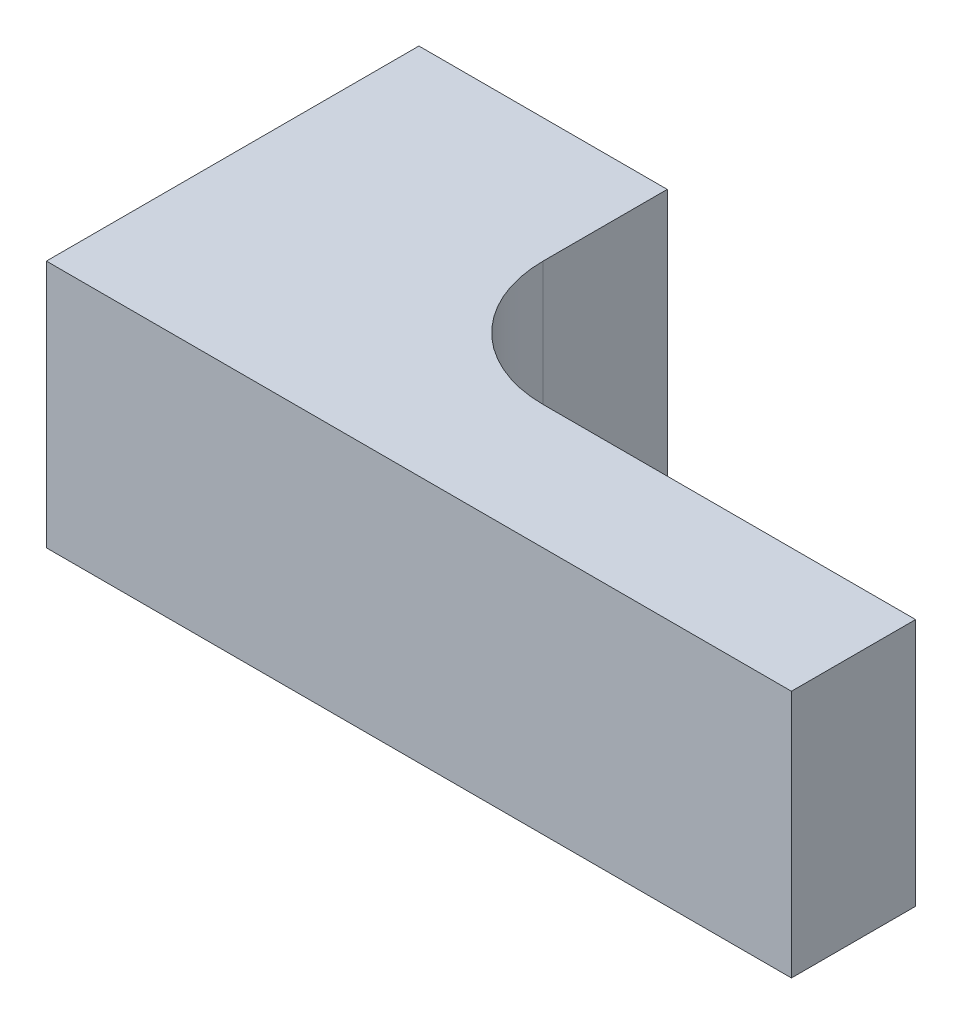
ISO-10303-21;
HEADER;
FILE_DESCRIPTION(('STEP AP214'),'2;1');
FILE_NAME('part.step','',(''),(''),'','','');
FILE_SCHEMA(('AUTOMOTIVE_DESIGN { 1 0 10303 214 1 1 1 1 }'));
ENDSEC;
DATA;
#1=APPLICATION_CONTEXT('core data for automotive mechanical design processes');
#2=APPLICATION_PROTOCOL_DEFINITION('international standard','automotive_design',2000,#1);
#3=PRODUCT_CONTEXT('',#1,'mechanical');
#4=PRODUCT('Part','Part','',(#3));
#5=PRODUCT_RELATED_PRODUCT_CATEGORY('part','',(#4));
#6=PRODUCT_DEFINITION_FORMATION('','',#4);
#7=PRODUCT_DEFINITION_CONTEXT('part definition',#1,'design');
#8=PRODUCT_DEFINITION('design','',#6,#7);
#9=PRODUCT_DEFINITION_SHAPE('','',#8);
#10=(LENGTH_UNIT() NAMED_UNIT(*) SI_UNIT(.MILLI.,.METRE.));
#11=(NAMED_UNIT(*) PLANE_ANGLE_UNIT() SI_UNIT($,.RADIAN.));
#12=(NAMED_UNIT(*) SI_UNIT($,.STERADIAN.) SOLID_ANGLE_UNIT());
#13=UNCERTAINTY_MEASURE_WITH_UNIT(LENGTH_MEASURE(1.E-05),#10,'distance_accuracy_value','');
#14=(GEOMETRIC_REPRESENTATION_CONTEXT(3) GLOBAL_UNCERTAINTY_ASSIGNED_CONTEXT((#13)) GLOBAL_UNIT_ASSIGNED_CONTEXT((#10,
#11,#12)) REPRESENTATION_CONTEXT('',''));
#15=CARTESIAN_POINT('',(0.,0.,0.));
#16=DIRECTION('',(0.,0.,1.));
#17=DIRECTION('',(1.,0.,0.));
#18=AXIS2_PLACEMENT_3D('',#15,#16,#17);
#19=CARTESIAN_POINT('',(-20.,20.,0.));
#20=DIRECTION('',(0.,0.,1.));
#21=DIRECTION('',(1.,0.,0.));
#22=AXIS2_PLACEMENT_3D('',#19,#20,#21);
#23=PLANE('',#22);
#24=DIRECTION('',(-1.,0.,0.));
#25=VECTOR('',#24,1.);
#26=CARTESIAN_POINT('',(-20.,0.,0.));
#27=LINE('',#26,#25);
#28=CARTESIAN_POINT('',(0.,0.,0.));
#29=VERTEX_POINT('',#28);
#30=CARTESIAN_POINT('',(-20.,0.,0.));
#31=VERTEX_POINT('',#30);
#32=EDGE_CURVE('E134',#29,#31,#27,.T.);
#33=ORIENTED_EDGE('',*,*,#32,.T.);
#34=DIRECTION('',(0.,-1.,0.));
#35=VECTOR('',#34,1.);
#36=CARTESIAN_POINT('',(-20.,20.,0.));
#37=LINE('',#36,#35);
#38=CARTESIAN_POINT('',(-20.,20.,0.));
#39=VERTEX_POINT('',#38);
#40=EDGE_CURVE('E11',#39,#31,#37,.T.);
#41=ORIENTED_EDGE('',*,*,#40,.F.);
#42=DIRECTION('',(-1.,0.,0.));
#43=VECTOR('',#42,1.);
#44=CARTESIAN_POINT('',(-20.,20.,0.));
#45=LINE('',#44,#43);
#46=CARTESIAN_POINT('',(0.,20.,0.));
#47=VERTEX_POINT('',#46);
#48=EDGE_CURVE('E153',#47,#39,#45,.T.);
#49=ORIENTED_EDGE('',*,*,#48,.F.);
#50=DIRECTION('',(0.,-1.,0.));
#51=VECTOR('',#50,1.);
#52=CARTESIAN_POINT('',(0.,20.,0.));
#53=LINE('',#52,#51);
#54=EDGE_CURVE('E130',#47,#29,#53,.T.);
#55=ORIENTED_EDGE('',*,*,#54,.T.);
#56=EDGE_LOOP('',(#33,#41,#49,#55));
#57=FACE_BOUND('',#56,.T.);
#58=ADVANCED_FACE('F39',(#57),#23,.F.);
#59=CARTESIAN_POINT('',(-20.,20.,30.));
#60=DIRECTION('',(1.,0.,0.));
#61=DIRECTION('',(0.,0.,-1.));
#62=AXIS2_PLACEMENT_3D('',#59,#60,#61);
#63=PLANE('',#62);
#64=DIRECTION('',(0.,0.,1.));
#65=VECTOR('',#64,1.);
#66=CARTESIAN_POINT('',(-20.,0.,30.));
#67=LINE('',#66,#65);
#68=CARTESIAN_POINT('',(-20.,0.,30.));
#69=VERTEX_POINT('',#68);
#70=EDGE_CURVE('E138',#31,#69,#67,.T.);
#71=ORIENTED_EDGE('',*,*,#70,.T.);
#72=DIRECTION('',(0.,-1.,0.));
#73=VECTOR('',#72,1.);
#74=CARTESIAN_POINT('',(-20.,20.,30.));
#75=LINE('',#74,#73);
#76=CARTESIAN_POINT('',(-20.,20.,30.));
#77=VERTEX_POINT('',#76);
#78=EDGE_CURVE('E48',#77,#69,#75,.T.);
#79=ORIENTED_EDGE('',*,*,#78,.F.);
#80=DIRECTION('',(0.,0.,1.));
#81=VECTOR('',#80,1.);
#82=CARTESIAN_POINT('',(-20.,20.,30.));
#83=LINE('',#82,#81);
#84=EDGE_CURVE('E96',#39,#77,#83,.T.);
#85=ORIENTED_EDGE('',*,*,#84,.F.);
#86=ORIENTED_EDGE('',*,*,#40,.T.);
#87=EDGE_LOOP('',(#71,#79,#85,#86));
#88=FACE_BOUND('',#87,.T.);
#89=ADVANCED_FACE('F187',(#88),#63,.F.);
#90=CARTESIAN_POINT('',(40.,20.,30.));
#91=DIRECTION('',(0.,0.,-1.));
#92=DIRECTION('',(-1.,0.,0.));
#93=AXIS2_PLACEMENT_3D('',#90,#91,#92);
#94=PLANE('',#93);
#95=DIRECTION('',(1.,0.,0.));
#96=VECTOR('',#95,1.);
#97=CARTESIAN_POINT('',(40.,0.,30.));
#98=LINE('',#97,#96);
#99=CARTESIAN_POINT('',(40.,0.,30.));
#100=VERTEX_POINT('',#99);
#101=EDGE_CURVE('E141',#69,#100,#98,.T.);
#102=ORIENTED_EDGE('',*,*,#101,.T.);
#103=DIRECTION('',(0.,-1.,0.));
#104=VECTOR('',#103,1.);
#105=CARTESIAN_POINT('',(40.,20.,30.));
#106=LINE('',#105,#104);
#107=CARTESIAN_POINT('',(40.,20.,30.));
#108=VERTEX_POINT('',#107);
#109=EDGE_CURVE('E160',#108,#100,#106,.T.);
#110=ORIENTED_EDGE('',*,*,#109,.F.);
#111=DIRECTION('',(1.,0.,0.));
#112=VECTOR('',#111,1.);
#113=CARTESIAN_POINT('',(40.,20.,30.));
#114=LINE('',#113,#112);
#115=EDGE_CURVE('E170',#77,#108,#114,.T.);
#116=ORIENTED_EDGE('',*,*,#115,.F.);
#117=ORIENTED_EDGE('',*,*,#78,.T.);
#118=EDGE_LOOP('',(#102,#110,#116,#117));
#119=FACE_BOUND('',#118,.T.);
#120=ADVANCED_FACE('F168',(#119),#94,.F.);
#121=CARTESIAN_POINT('',(40.,20.,20.));
#122=DIRECTION('',(-1.,0.,0.));
#123=DIRECTION('',(0.,0.,1.));
#124=AXIS2_PLACEMENT_3D('',#121,#122,#123);
#125=PLANE('',#124);
#126=DIRECTION('',(0.,0.,-1.));
#127=VECTOR('',#126,1.);
#128=CARTESIAN_POINT('',(40.,0.,20.));
#129=LINE('',#128,#127);
#130=CARTESIAN_POINT('',(40.,0.,20.));
#131=VERTEX_POINT('',#130);
#132=EDGE_CURVE('E144',#100,#131,#129,.T.);
#133=ORIENTED_EDGE('',*,*,#132,.T.);
#134=DIRECTION('',(0.,-1.,0.));
#135=VECTOR('',#134,1.);
#136=CARTESIAN_POINT('',(40.,20.,20.));
#137=LINE('',#136,#135);
#138=CARTESIAN_POINT('',(40.,20.,20.));
#139=VERTEX_POINT('',#138);
#140=EDGE_CURVE('E123',#139,#131,#137,.T.);
#141=ORIENTED_EDGE('',*,*,#140,.F.);
#142=DIRECTION('',(0.,0.,-1.));
#143=VECTOR('',#142,1.);
#144=CARTESIAN_POINT('',(40.,20.,20.));
#145=LINE('',#144,#143);
#146=EDGE_CURVE('E112',#108,#139,#145,.T.);
#147=ORIENTED_EDGE('',*,*,#146,.F.);
#148=ORIENTED_EDGE('',*,*,#109,.T.);
#149=EDGE_LOOP('',(#133,#141,#147,#148));
#150=FACE_BOUND('',#149,.T.);
#151=ADVANCED_FACE('F176',(#150),#125,.F.);
#152=CARTESIAN_POINT('',(10.,20.,20.));
#153=DIRECTION('',(0.,0.,1.));
#154=DIRECTION('',(1.,0.,0.));
#155=AXIS2_PLACEMENT_3D('',#152,#153,#154);
#156=PLANE('',#155);
#157=DIRECTION('',(-1.,0.,0.));
#158=VECTOR('',#157,1.);
#159=CARTESIAN_POINT('',(10.,0.,20.));
#160=LINE('',#159,#158);
#161=CARTESIAN_POINT('',(10.,0.,20.));
#162=VERTEX_POINT('',#161);
#163=EDGE_CURVE('E121',#131,#162,#160,.T.);
#164=ORIENTED_EDGE('',*,*,#163,.T.);
#165=DIRECTION('',(0.,-1.,0.));
#166=VECTOR('',#165,1.);
#167=CARTESIAN_POINT('',(10.,20.,20.));
#168=LINE('',#167,#166);
#169=CARTESIAN_POINT('',(10.,20.,20.));
#170=VERTEX_POINT('',#169);
#171=EDGE_CURVE('E118',#170,#162,#168,.T.);
#172=ORIENTED_EDGE('',*,*,#171,.F.);
#173=DIRECTION('',(-1.,0.,0.));
#174=VECTOR('',#173,1.);
#175=CARTESIAN_POINT('',(10.,20.,20.));
#176=LINE('',#175,#174);
#177=EDGE_CURVE('E106',#139,#170,#176,.T.);
#178=ORIENTED_EDGE('',*,*,#177,.F.);
#179=ORIENTED_EDGE('',*,*,#140,.T.);
#180=EDGE_LOOP('',(#164,#172,#178,#179));
#181=FACE_BOUND('',#180,.T.);
#182=ADVANCED_FACE('F119',(#181),#156,.F.);
#183=CARTESIAN_POINT('',(10.,20.,10.));
#184=DIRECTION('',(0.,-1.,0.));
#185=DIRECTION('',(0.,0.,-1.));
#186=AXIS2_PLACEMENT_3D('',#183,#184,#185);
#187=CYLINDRICAL_SURFACE('',#186,10.);
#188=CARTESIAN_POINT('',(10.,0.,10.));
#189=DIRECTION('',(0.,-1.,0.));
#190=DIRECTION('',(0.,0.,1.));
#191=AXIS2_PLACEMENT_3D('',#188,#189,#190);
#192=CIRCLE('',#191,10.);
#193=CARTESIAN_POINT('',(0.,0.,10.));
#194=VERTEX_POINT('',#193);
#195=EDGE_CURVE('E82',#162,#194,#192,.T.);
#196=ORIENTED_EDGE('',*,*,#195,.T.);
#197=DIRECTION('',(0.,-1.,0.));
#198=VECTOR('',#197,1.);
#199=CARTESIAN_POINT('',(0.,20.,10.));
#200=LINE('',#199,#198);
#201=CARTESIAN_POINT('',(0.,20.,10.));
#202=VERTEX_POINT('',#201);
#203=EDGE_CURVE('E124',#202,#194,#200,.T.);
#204=ORIENTED_EDGE('',*,*,#203,.F.);
#205=CARTESIAN_POINT('',(10.,20.,10.));
#206=DIRECTION('',(0.,-1.,0.));
#207=DIRECTION('',(0.,0.,1.));
#208=AXIS2_PLACEMENT_3D('',#205,#206,#207);
#209=CIRCLE('',#208,10.);
#210=EDGE_CURVE('E110',#170,#202,#209,.T.);
#211=ORIENTED_EDGE('',*,*,#210,.F.);
#212=ORIENTED_EDGE('',*,*,#171,.T.);
#213=EDGE_LOOP('',(#196,#204,#211,#212));
#214=FACE_BOUND('',#213,.T.);
#215=ADVANCED_FACE('F126',(#214),#187,.F.);
#216=CARTESIAN_POINT('',(0.,20.,0.));
#217=DIRECTION('',(-1.,0.,0.));
#218=DIRECTION('',(0.,0.,1.));
#219=AXIS2_PLACEMENT_3D('',#216,#217,#218);
#220=PLANE('',#219);
#221=DIRECTION('',(0.,0.,-1.));
#222=VECTOR('',#221,1.);
#223=CARTESIAN_POINT('',(0.,0.,0.));
#224=LINE('',#223,#222);
#225=EDGE_CURVE('E88',#194,#29,#224,.T.);
#226=ORIENTED_EDGE('',*,*,#225,.T.);
#227=ORIENTED_EDGE('',*,*,#54,.F.);
#228=DIRECTION('',(0.,0.,-1.));
#229=VECTOR('',#228,1.);
#230=CARTESIAN_POINT('',(0.,20.,0.));
#231=LINE('',#230,#229);
#232=EDGE_CURVE('E56',#202,#47,#231,.T.);
#233=ORIENTED_EDGE('',*,*,#232,.F.);
#234=ORIENTED_EDGE('',*,*,#203,.T.);
#235=EDGE_LOOP('',(#226,#227,#233,#234));
#236=FACE_BOUND('',#235,.T.);
#237=ADVANCED_FACE('F201',(#236),#220,.F.);
#238=CARTESIAN_POINT('',(10.,20.,10.));
#239=DIRECTION('',(0.,1.,0.));
#240=DIRECTION('',(0.,0.,1.));
#241=AXIS2_PLACEMENT_3D('',#238,#239,#240);
#242=PLANE('',#241);
#243=ORIENTED_EDGE('',*,*,#48,.T.);
#244=ORIENTED_EDGE('',*,*,#84,.T.);
#245=ORIENTED_EDGE('',*,*,#115,.T.);
#246=ORIENTED_EDGE('',*,*,#146,.T.);
#247=ORIENTED_EDGE('',*,*,#177,.T.);
#248=ORIENTED_EDGE('',*,*,#210,.T.);
#249=ORIENTED_EDGE('',*,*,#232,.T.);
#250=EDGE_LOOP('',(#243,#244,#245,#246,#247,#248,#249));
#251=FACE_BOUND('',#250,.T.);
#252=ADVANCED_FACE('F108',(#251),#242,.T.);
#253=CARTESIAN_POINT('',(10.,0.,10.));
#254=DIRECTION('',(0.,1.,0.));
#255=DIRECTION('',(0.,0.,1.));
#256=AXIS2_PLACEMENT_3D('',#253,#254,#255);
#257=PLANE('',#256);
#258=ORIENTED_EDGE('',*,*,#32,.F.);
#259=ORIENTED_EDGE('',*,*,#225,.F.);
#260=ORIENTED_EDGE('',*,*,#195,.F.);
#261=ORIENTED_EDGE('',*,*,#163,.F.);
#262=ORIENTED_EDGE('',*,*,#132,.F.);
#263=ORIENTED_EDGE('',*,*,#101,.F.);
#264=ORIENTED_EDGE('',*,*,#70,.F.);
#265=EDGE_LOOP('',(#258,#259,#260,#261,#262,#263,#264));
#266=FACE_BOUND('',#265,.T.);
#267=ADVANCED_FACE('F174',(#266),#257,.F.);
#268=CLOSED_SHELL('',(#58,#89,#120,#151,#182,#215,#237,#252,#267));
#269=MANIFOLD_SOLID_BREP('B2',#268);
#270=ADVANCED_BREP_SHAPE_REPRESENTATION('',(#18,#269),#14);
#271=SHAPE_DEFINITION_REPRESENTATION(#9,#270);
ENDSEC;
END-ISO-10303-21;
